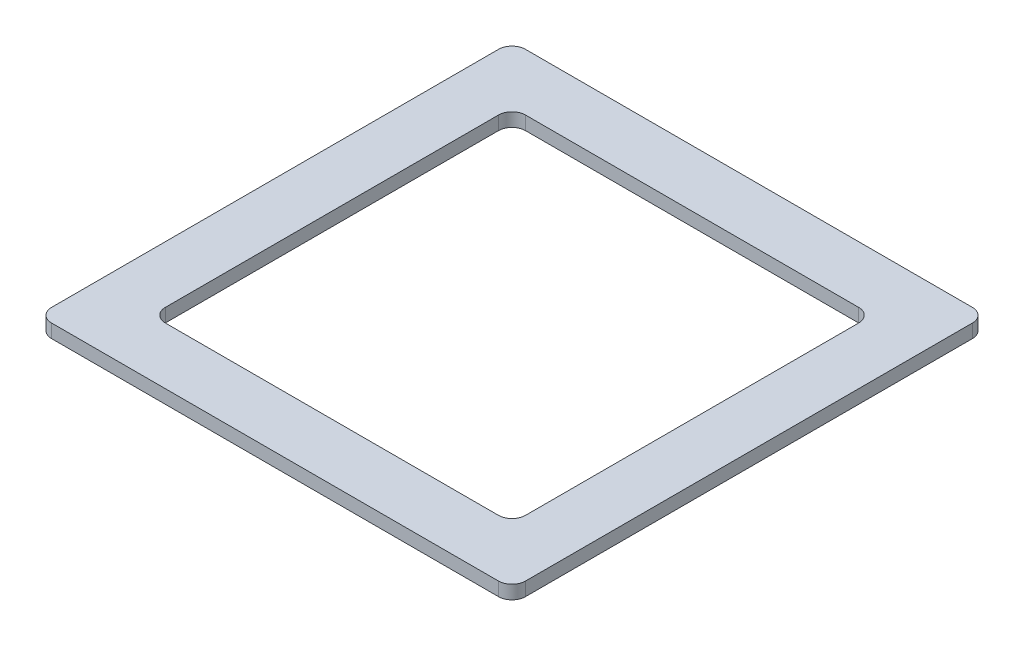
ISO-10303-21;
HEADER;
FILE_DESCRIPTION(('STEP AP214'),'2;1');
FILE_NAME('part.step','',(''),(''),'','','');
FILE_SCHEMA(('AUTOMOTIVE_DESIGN { 1 0 10303 214 1 1 1 1 }'));
ENDSEC;
DATA;
#1=APPLICATION_CONTEXT('core data for automotive mechanical design processes');
#2=APPLICATION_PROTOCOL_DEFINITION('international standard','automotive_design',2000,#1);
#3=PRODUCT_CONTEXT('',#1,'mechanical');
#4=PRODUCT('Part','Part','',(#3));
#5=PRODUCT_RELATED_PRODUCT_CATEGORY('part','',(#4));
#6=PRODUCT_DEFINITION_FORMATION('','',#4);
#7=PRODUCT_DEFINITION_CONTEXT('part definition',#1,'design');
#8=PRODUCT_DEFINITION('design','',#6,#7);
#9=PRODUCT_DEFINITION_SHAPE('','',#8);
#10=(LENGTH_UNIT() NAMED_UNIT(*) SI_UNIT(.MILLI.,.METRE.));
#11=(NAMED_UNIT(*) PLANE_ANGLE_UNIT() SI_UNIT($,.RADIAN.));
#12=(NAMED_UNIT(*) SI_UNIT($,.STERADIAN.) SOLID_ANGLE_UNIT());
#13=UNCERTAINTY_MEASURE_WITH_UNIT(LENGTH_MEASURE(1.E-05),#10,'distance_accuracy_value','');
#14=(GEOMETRIC_REPRESENTATION_CONTEXT(3) GLOBAL_UNCERTAINTY_ASSIGNED_CONTEXT((#13)) GLOBAL_UNIT_ASSIGNED_CONTEXT((#10,
#11,#12)) REPRESENTATION_CONTEXT('',''));
#15=CARTESIAN_POINT('',(0.,0.,0.));
#16=DIRECTION('',(0.,0.,1.));
#17=DIRECTION('',(1.,0.,0.));
#18=AXIS2_PLACEMENT_3D('',#15,#16,#17);
#19=CARTESIAN_POINT('',(175.,10.,175.));
#20=DIRECTION('',(-1.,0.,0.));
#21=DIRECTION('',(0.,0.,1.));
#22=AXIS2_PLACEMENT_3D('',#19,#20,#21);
#23=PLANE('',#22);
#24=DIRECTION('',(0.,0.,-1.));
#25=VECTOR('',#24,1.);
#26=CARTESIAN_POINT('',(175.,0.,175.));
#27=LINE('',#26,#25);
#28=CARTESIAN_POINT('',(175.,0.,165.));
#29=VERTEX_POINT('',#28);
#30=CARTESIAN_POINT('',(175.,0.,-165.));
#31=VERTEX_POINT('',#30);
#32=EDGE_CURVE('E195',#29,#31,#27,.T.);
#33=ORIENTED_EDGE('',*,*,#32,.T.);
#34=DIRECTION('',(0.,-1.,0.));
#35=VECTOR('',#34,1.);
#36=CARTESIAN_POINT('',(175.,10.,-165.));
#37=LINE('',#36,#35);
#38=CARTESIAN_POINT('',(175.,10.,-165.));
#39=VERTEX_POINT('',#38);
#40=EDGE_CURVE('E226',#31,#39,#37,.F.);
#41=ORIENTED_EDGE('',*,*,#40,.T.);
#42=DIRECTION('',(0.,0.,-1.));
#43=VECTOR('',#42,1.);
#44=CARTESIAN_POINT('',(175.,10.,175.));
#45=LINE('',#44,#43);
#46=CARTESIAN_POINT('',(175.,10.,165.));
#47=VERTEX_POINT('',#46);
#48=EDGE_CURVE('E184',#47,#39,#45,.T.);
#49=ORIENTED_EDGE('',*,*,#48,.F.);
#50=DIRECTION('',(0.,-1.,0.));
#51=VECTOR('',#50,1.);
#52=CARTESIAN_POINT('',(175.,10.,165.));
#53=LINE('',#52,#51);
#54=EDGE_CURVE('E223',#47,#29,#53,.T.);
#55=ORIENTED_EDGE('',*,*,#54,.T.);
#56=EDGE_LOOP('',(#33,#41,#49,#55));
#57=FACE_BOUND('',#56,.T.);
#58=ADVANCED_FACE('F33',(#57),#23,.F.);
#59=CARTESIAN_POINT('',(-175.,10.,-175.));
#60=DIRECTION('',(0.,0.,1.));
#61=DIRECTION('',(1.,0.,0.));
#62=AXIS2_PLACEMENT_3D('',#59,#60,#61);
#63=PLANE('',#62);
#64=DIRECTION('',(-1.,0.,0.));
#65=VECTOR('',#64,1.);
#66=CARTESIAN_POINT('',(-175.,10.,-175.));
#67=LINE('',#66,#65);
#68=CARTESIAN_POINT('',(165.,10.,-175.));
#69=VERTEX_POINT('',#68);
#70=CARTESIAN_POINT('',(-165.,10.,-175.));
#71=VERTEX_POINT('',#70);
#72=EDGE_CURVE('E187',#69,#71,#67,.T.);
#73=ORIENTED_EDGE('',*,*,#72,.F.);
#74=DIRECTION('',(0.,-1.,0.));
#75=VECTOR('',#74,1.);
#76=CARTESIAN_POINT('',(165.,10.,-175.));
#77=LINE('',#76,#75);
#78=CARTESIAN_POINT('',(165.,0.,-175.));
#79=VERTEX_POINT('',#78);
#80=EDGE_CURVE('E212',#69,#79,#77,.T.);
#81=ORIENTED_EDGE('',*,*,#80,.T.);
#82=DIRECTION('',(-1.,0.,0.));
#83=VECTOR('',#82,1.);
#84=CARTESIAN_POINT('',(-175.,0.,-175.));
#85=LINE('',#84,#83);
#86=CARTESIAN_POINT('',(-165.,0.,-175.));
#87=VERTEX_POINT('',#86);
#88=EDGE_CURVE('E198',#79,#87,#85,.T.);
#89=ORIENTED_EDGE('',*,*,#88,.T.);
#90=DIRECTION('',(0.,-1.,0.));
#91=VECTOR('',#90,1.);
#92=CARTESIAN_POINT('',(-165.,10.,-175.));
#93=LINE('',#92,#91);
#94=EDGE_CURVE('E210',#87,#71,#93,.F.);
#95=ORIENTED_EDGE('',*,*,#94,.T.);
#96=EDGE_LOOP('',(#73,#81,#89,#95));
#97=FACE_BOUND('',#96,.T.);
#98=ADVANCED_FACE('F308',(#97),#63,.F.);
#99=CARTESIAN_POINT('',(-175.,10.,175.));
#100=DIRECTION('',(1.,0.,0.));
#101=DIRECTION('',(0.,0.,-1.));
#102=AXIS2_PLACEMENT_3D('',#99,#100,#101);
#103=PLANE('',#102);
#104=DIRECTION('',(0.,0.,1.));
#105=VECTOR('',#104,1.);
#106=CARTESIAN_POINT('',(-175.,10.,175.));
#107=LINE('',#106,#105);
#108=CARTESIAN_POINT('',(-175.,10.,-165.));
#109=VERTEX_POINT('',#108);
#110=CARTESIAN_POINT('',(-175.,10.,165.));
#111=VERTEX_POINT('',#110);
#112=EDGE_CURVE('E191',#109,#111,#107,.T.);
#113=ORIENTED_EDGE('',*,*,#112,.F.);
#114=DIRECTION('',(0.,-1.,0.));
#115=VECTOR('',#114,1.);
#116=CARTESIAN_POINT('',(-175.,10.,-165.));
#117=LINE('',#116,#115);
#118=CARTESIAN_POINT('',(-175.,0.,-165.));
#119=VERTEX_POINT('',#118);
#120=EDGE_CURVE('E158',#109,#119,#117,.T.);
#121=ORIENTED_EDGE('',*,*,#120,.T.);
#122=DIRECTION('',(0.,0.,1.));
#123=VECTOR('',#122,1.);
#124=CARTESIAN_POINT('',(-175.,0.,175.));
#125=LINE('',#124,#123);
#126=CARTESIAN_POINT('',(-175.,0.,165.));
#127=VERTEX_POINT('',#126);
#128=EDGE_CURVE('E202',#119,#127,#125,.T.);
#129=ORIENTED_EDGE('',*,*,#128,.T.);
#130=DIRECTION('',(0.,-1.,0.));
#131=VECTOR('',#130,1.);
#132=CARTESIAN_POINT('',(-175.,10.,165.));
#133=LINE('',#132,#131);
#134=EDGE_CURVE('E249',#127,#111,#133,.F.);
#135=ORIENTED_EDGE('',*,*,#134,.T.);
#136=EDGE_LOOP('',(#113,#121,#129,#135));
#137=FACE_BOUND('',#136,.T.);
#138=ADVANCED_FACE('F314',(#137),#103,.F.);
#139=CARTESIAN_POINT('',(-175.,10.,175.));
#140=DIRECTION('',(0.,0.,-1.));
#141=DIRECTION('',(-1.,0.,0.));
#142=AXIS2_PLACEMENT_3D('',#139,#140,#141);
#143=PLANE('',#142);
#144=DIRECTION('',(1.,0.,0.));
#145=VECTOR('',#144,1.);
#146=CARTESIAN_POINT('',(-175.,0.,175.));
#147=LINE('',#146,#145);
#148=CARTESIAN_POINT('',(-165.,0.,175.));
#149=VERTEX_POINT('',#148);
#150=CARTESIAN_POINT('',(165.,0.,175.));
#151=VERTEX_POINT('',#150);
#152=EDGE_CURVE('E188',#149,#151,#147,.T.);
#153=ORIENTED_EDGE('',*,*,#152,.T.);
#154=DIRECTION('',(0.,-1.,0.));
#155=VECTOR('',#154,1.);
#156=CARTESIAN_POINT('',(165.,10.,175.));
#157=LINE('',#156,#155);
#158=CARTESIAN_POINT('',(165.,10.,175.));
#159=VERTEX_POINT('',#158);
#160=EDGE_CURVE('E48',#151,#159,#157,.F.);
#161=ORIENTED_EDGE('',*,*,#160,.T.);
#162=DIRECTION('',(1.,0.,0.));
#163=VECTOR('',#162,1.);
#164=CARTESIAN_POINT('',(-175.,10.,175.));
#165=LINE('',#164,#163);
#166=CARTESIAN_POINT('',(-165.,10.,175.));
#167=VERTEX_POINT('',#166);
#168=EDGE_CURVE('E193',#167,#159,#165,.T.);
#169=ORIENTED_EDGE('',*,*,#168,.F.);
#170=DIRECTION('',(0.,-1.,0.));
#171=VECTOR('',#170,1.);
#172=CARTESIAN_POINT('',(-165.,10.,175.));
#173=LINE('',#172,#171);
#174=EDGE_CURVE('E245',#167,#149,#173,.T.);
#175=ORIENTED_EDGE('',*,*,#174,.T.);
#176=EDGE_LOOP('',(#153,#161,#169,#175));
#177=FACE_BOUND('',#176,.T.);
#178=ADVANCED_FACE('F334',(#177),#143,.F.);
#179=CARTESIAN_POINT('',(0.,10.,0.));
#180=DIRECTION('',(0.,-1.,0.));
#181=DIRECTION('',(0.,0.,-1.));
#182=AXIS2_PLACEMENT_3D('',#179,#180,#181);
#183=PLANE('',#182);
#184=DIRECTION('',(-1.,0.,0.));
#185=VECTOR('',#184,1.);
#186=CARTESIAN_POINT('',(-133.,10.,-133.));
#187=LINE('',#186,#185);
#188=CARTESIAN_POINT('',(123.,10.,-133.));
#189=VERTEX_POINT('',#188);
#190=CARTESIAN_POINT('',(-123.,10.,-133.));
#191=VERTEX_POINT('',#190);
#192=EDGE_CURVE('E175',#189,#191,#187,.T.);
#193=ORIENTED_EDGE('',*,*,#192,.F.);
#194=CARTESIAN_POINT('',(123.,10.,-123.));
#195=DIRECTION('',(0.,-1.,0.));
#196=DIRECTION('',(0.,0.,-1.));
#197=AXIS2_PLACEMENT_3D('',#194,#195,#196);
#198=CIRCLE('',#197,10.);
#199=CARTESIAN_POINT('',(133.,10.,-123.));
#200=VERTEX_POINT('',#199);
#201=EDGE_CURVE('E41',#189,#200,#198,.T.);
#202=ORIENTED_EDGE('',*,*,#201,.T.);
#203=DIRECTION('',(0.,0.,-1.));
#204=VECTOR('',#203,1.);
#205=CARTESIAN_POINT('',(133.,10.,133.));
#206=LINE('',#205,#204);
#207=CARTESIAN_POINT('',(133.,10.,123.));
#208=VERTEX_POINT('',#207);
#209=EDGE_CURVE('E180',#208,#200,#206,.T.);
#210=ORIENTED_EDGE('',*,*,#209,.F.);
#211=CARTESIAN_POINT('',(123.,10.,123.));
#212=DIRECTION('',(0.,-1.,0.));
#213=DIRECTION('',(0.,0.,-1.));
#214=AXIS2_PLACEMENT_3D('',#211,#212,#213);
#215=CIRCLE('',#214,10.);
#216=CARTESIAN_POINT('',(123.,10.,133.));
#217=VERTEX_POINT('',#216);
#218=EDGE_CURVE('E257',#208,#217,#215,.T.);
#219=ORIENTED_EDGE('',*,*,#218,.T.);
#220=DIRECTION('',(1.,0.,0.));
#221=VECTOR('',#220,1.);
#222=CARTESIAN_POINT('',(-133.,10.,133.));
#223=LINE('',#222,#221);
#224=CARTESIAN_POINT('',(-123.,10.,133.));
#225=VERTEX_POINT('',#224);
#226=EDGE_CURVE('E174',#225,#217,#223,.T.);
#227=ORIENTED_EDGE('',*,*,#226,.F.);
#228=CARTESIAN_POINT('',(-123.,10.,123.));
#229=DIRECTION('',(0.,-1.,0.));
#230=DIRECTION('',(0.,0.,-1.));
#231=AXIS2_PLACEMENT_3D('',#228,#229,#230);
#232=CIRCLE('',#231,10.);
#233=CARTESIAN_POINT('',(-133.,10.,123.));
#234=VERTEX_POINT('',#233);
#235=EDGE_CURVE('E173',#225,#234,#232,.T.);
#236=ORIENTED_EDGE('',*,*,#235,.T.);
#237=DIRECTION('',(0.,0.,1.));
#238=VECTOR('',#237,1.);
#239=CARTESIAN_POINT('',(-133.,10.,133.));
#240=LINE('',#239,#238);
#241=CARTESIAN_POINT('',(-133.,10.,-123.));
#242=VERTEX_POINT('',#241);
#243=EDGE_CURVE('E164',#242,#234,#240,.T.);
#244=ORIENTED_EDGE('',*,*,#243,.F.);
#245=CARTESIAN_POINT('',(-123.,10.,-123.));
#246=DIRECTION('',(0.,-1.,0.));
#247=DIRECTION('',(0.,0.,-1.));
#248=AXIS2_PLACEMENT_3D('',#245,#246,#247);
#249=CIRCLE('',#248,10.);
#250=EDGE_CURVE('E147',#242,#191,#249,.T.);
#251=ORIENTED_EDGE('',*,*,#250,.T.);
#252=EDGE_LOOP('',(#193,#202,#210,#219,#227,#236,#244,#251));
#253=FACE_BOUND('',#252,.T.);
#254=ORIENTED_EDGE('',*,*,#48,.T.);
#255=CARTESIAN_POINT('',(165.,10.,-165.));
#256=DIRECTION('',(0.,-1.,0.));
#257=DIRECTION('',(0.,0.,-1.));
#258=AXIS2_PLACEMENT_3D('',#255,#256,#257);
#259=CIRCLE('',#258,10.);
#260=EDGE_CURVE('E233',#39,#69,#259,.F.);
#261=ORIENTED_EDGE('',*,*,#260,.T.);
#262=ORIENTED_EDGE('',*,*,#72,.T.);
#263=CARTESIAN_POINT('',(-165.,10.,-165.));
#264=DIRECTION('',(0.,-1.,0.));
#265=DIRECTION('',(0.,0.,-1.));
#266=AXIS2_PLACEMENT_3D('',#263,#264,#265);
#267=CIRCLE('',#266,10.);
#268=EDGE_CURVE('E229',#71,#109,#267,.F.);
#269=ORIENTED_EDGE('',*,*,#268,.T.);
#270=ORIENTED_EDGE('',*,*,#112,.T.);
#271=CARTESIAN_POINT('',(-165.,10.,165.));
#272=DIRECTION('',(0.,-1.,0.));
#273=DIRECTION('',(0.,0.,-1.));
#274=AXIS2_PLACEMENT_3D('',#271,#272,#273);
#275=CIRCLE('',#274,10.);
#276=EDGE_CURVE('E55',#111,#167,#275,.F.);
#277=ORIENTED_EDGE('',*,*,#276,.T.);
#278=ORIENTED_EDGE('',*,*,#168,.T.);
#279=CARTESIAN_POINT('',(165.,10.,165.));
#280=DIRECTION('',(0.,-1.,0.));
#281=DIRECTION('',(0.,0.,-1.));
#282=AXIS2_PLACEMENT_3D('',#279,#280,#281);
#283=CIRCLE('',#282,10.);
#284=EDGE_CURVE('E231',#159,#47,#283,.F.);
#285=ORIENTED_EDGE('',*,*,#284,.T.);
#286=EDGE_LOOP('',(#254,#261,#262,#269,#270,#277,#278,#285));
#287=FACE_BOUND('',#286,.T.);
#288=ADVANCED_FACE('F171',(#253,#287),#183,.F.);
#289=CARTESIAN_POINT('',(0.,0.,0.));
#290=DIRECTION('',(0.,-1.,0.));
#291=DIRECTION('',(0.,0.,-1.));
#292=AXIS2_PLACEMENT_3D('',#289,#290,#291);
#293=PLANE('',#292);
#294=DIRECTION('',(1.,0.,0.));
#295=VECTOR('',#294,1.);
#296=CARTESIAN_POINT('',(-133.,0.,133.));
#297=LINE('',#296,#295);
#298=CARTESIAN_POINT('',(-123.,0.,133.));
#299=VERTEX_POINT('',#298);
#300=CARTESIAN_POINT('',(123.,0.,133.));
#301=VERTEX_POINT('',#300);
#302=EDGE_CURVE('E199',#299,#301,#297,.T.);
#303=ORIENTED_EDGE('',*,*,#302,.T.);
#304=CARTESIAN_POINT('',(123.,0.,123.));
#305=DIRECTION('',(0.,-1.,0.));
#306=DIRECTION('',(0.,0.,-1.));
#307=AXIS2_PLACEMENT_3D('',#304,#305,#306);
#308=CIRCLE('',#307,10.);
#309=CARTESIAN_POINT('',(133.,0.,123.));
#310=VERTEX_POINT('',#309);
#311=EDGE_CURVE('E259',#301,#310,#308,.F.);
#312=ORIENTED_EDGE('',*,*,#311,.T.);
#313=DIRECTION('',(0.,0.,-1.));
#314=VECTOR('',#313,1.);
#315=CARTESIAN_POINT('',(133.,0.,133.));
#316=LINE('',#315,#314);
#317=CARTESIAN_POINT('',(133.,0.,-123.));
#318=VERTEX_POINT('',#317);
#319=EDGE_CURVE('E178',#310,#318,#316,.T.);
#320=ORIENTED_EDGE('',*,*,#319,.T.);
#321=CARTESIAN_POINT('',(123.,0.,-123.));
#322=DIRECTION('',(0.,-1.,0.));
#323=DIRECTION('',(0.,0.,-1.));
#324=AXIS2_PLACEMENT_3D('',#321,#322,#323);
#325=CIRCLE('',#324,10.);
#326=CARTESIAN_POINT('',(123.,0.,-133.));
#327=VERTEX_POINT('',#326);
#328=EDGE_CURVE('E11',#318,#327,#325,.F.);
#329=ORIENTED_EDGE('',*,*,#328,.T.);
#330=DIRECTION('',(-1.,0.,0.));
#331=VECTOR('',#330,1.);
#332=CARTESIAN_POINT('',(-133.,0.,-133.));
#333=LINE('',#332,#331);
#334=CARTESIAN_POINT('',(-123.,0.,-133.));
#335=VERTEX_POINT('',#334);
#336=EDGE_CURVE('E278',#327,#335,#333,.T.);
#337=ORIENTED_EDGE('',*,*,#336,.T.);
#338=CARTESIAN_POINT('',(-123.,0.,-123.));
#339=DIRECTION('',(0.,-1.,0.));
#340=DIRECTION('',(0.,0.,-1.));
#341=AXIS2_PLACEMENT_3D('',#338,#339,#340);
#342=CIRCLE('',#341,10.);
#343=CARTESIAN_POINT('',(-133.,0.,-123.));
#344=VERTEX_POINT('',#343);
#345=EDGE_CURVE('E157',#335,#344,#342,.F.);
#346=ORIENTED_EDGE('',*,*,#345,.T.);
#347=DIRECTION('',(0.,0.,1.));
#348=VECTOR('',#347,1.);
#349=CARTESIAN_POINT('',(-133.,0.,133.));
#350=LINE('',#349,#348);
#351=CARTESIAN_POINT('',(-133.,0.,123.));
#352=VERTEX_POINT('',#351);
#353=EDGE_CURVE('E167',#344,#352,#350,.T.);
#354=ORIENTED_EDGE('',*,*,#353,.T.);
#355=CARTESIAN_POINT('',(-123.,0.,123.));
#356=DIRECTION('',(0.,-1.,0.));
#357=DIRECTION('',(0.,0.,-1.));
#358=AXIS2_PLACEMENT_3D('',#355,#356,#357);
#359=CIRCLE('',#358,10.);
#360=EDGE_CURVE('E255',#352,#299,#359,.F.);
#361=ORIENTED_EDGE('',*,*,#360,.T.);
#362=EDGE_LOOP('',(#303,#312,#320,#329,#337,#346,#354,#361));
#363=FACE_BOUND('',#362,.T.);
#364=ORIENTED_EDGE('',*,*,#88,.F.);
#365=CARTESIAN_POINT('',(165.,0.,-165.));
#366=DIRECTION('',(0.,-1.,0.));
#367=DIRECTION('',(0.,0.,-1.));
#368=AXIS2_PLACEMENT_3D('',#365,#366,#367);
#369=CIRCLE('',#368,10.);
#370=EDGE_CURVE('E221',#79,#31,#369,.T.);
#371=ORIENTED_EDGE('',*,*,#370,.T.);
#372=ORIENTED_EDGE('',*,*,#32,.F.);
#373=CARTESIAN_POINT('',(165.,0.,165.));
#374=DIRECTION('',(0.,-1.,0.));
#375=DIRECTION('',(0.,0.,-1.));
#376=AXIS2_PLACEMENT_3D('',#373,#374,#375);
#377=CIRCLE('',#376,10.);
#378=EDGE_CURVE('E219',#29,#151,#377,.T.);
#379=ORIENTED_EDGE('',*,*,#378,.T.);
#380=ORIENTED_EDGE('',*,*,#152,.F.);
#381=CARTESIAN_POINT('',(-165.,0.,165.));
#382=DIRECTION('',(0.,-1.,0.));
#383=DIRECTION('',(0.,0.,-1.));
#384=AXIS2_PLACEMENT_3D('',#381,#382,#383);
#385=CIRCLE('',#384,10.);
#386=EDGE_CURVE('E215',#149,#127,#385,.T.);
#387=ORIENTED_EDGE('',*,*,#386,.T.);
#388=ORIENTED_EDGE('',*,*,#128,.F.);
#389=CARTESIAN_POINT('',(-165.,0.,-165.));
#390=DIRECTION('',(0.,-1.,0.));
#391=DIRECTION('',(0.,0.,-1.));
#392=AXIS2_PLACEMENT_3D('',#389,#390,#391);
#393=CIRCLE('',#392,10.);
#394=EDGE_CURVE('E217',#119,#87,#393,.T.);
#395=ORIENTED_EDGE('',*,*,#394,.T.);
#396=EDGE_LOOP('',(#364,#371,#372,#379,#380,#387,#388,#395));
#397=FACE_BOUND('',#396,.T.);
#398=ADVANCED_FACE('F276',(#363,#397),#293,.T.);
#399=CARTESIAN_POINT('',(133.,0.,133.));
#400=DIRECTION('',(1.,0.,0.));
#401=DIRECTION('',(0.,0.,-1.));
#402=AXIS2_PLACEMENT_3D('',#399,#400,#401);
#403=PLANE('',#402);
#404=ORIENTED_EDGE('',*,*,#319,.F.);
#405=DIRECTION('',(0.,1.,0.));
#406=VECTOR('',#405,1.);
#407=CARTESIAN_POINT('',(133.,10.,123.));
#408=LINE('',#407,#406);
#409=EDGE_CURVE('E242',#310,#208,#408,.T.);
#410=ORIENTED_EDGE('',*,*,#409,.T.);
#411=ORIENTED_EDGE('',*,*,#209,.T.);
#412=DIRECTION('',(0.,1.,0.));
#413=VECTOR('',#412,1.);
#414=CARTESIAN_POINT('',(133.,0.,-123.));
#415=LINE('',#414,#413);
#416=EDGE_CURVE('E240',#200,#318,#415,.F.);
#417=ORIENTED_EDGE('',*,*,#416,.T.);
#418=EDGE_LOOP('',(#404,#410,#411,#417));
#419=FACE_BOUND('',#418,.T.);
#420=ADVANCED_FACE('F267',(#419),#403,.F.);
#421=CARTESIAN_POINT('',(-133.,0.,133.));
#422=DIRECTION('',(0.,0.,1.));
#423=DIRECTION('',(1.,0.,0.));
#424=AXIS2_PLACEMENT_3D('',#421,#422,#423);
#425=PLANE('',#424);
#426=ORIENTED_EDGE('',*,*,#302,.F.);
#427=DIRECTION('',(0.,1.,0.));
#428=VECTOR('',#427,1.);
#429=CARTESIAN_POINT('',(-123.,10.,133.));
#430=LINE('',#429,#428);
#431=EDGE_CURVE('E237',#299,#225,#430,.T.);
#432=ORIENTED_EDGE('',*,*,#431,.T.);
#433=ORIENTED_EDGE('',*,*,#226,.T.);
#434=DIRECTION('',(0.,1.,0.));
#435=VECTOR('',#434,1.);
#436=CARTESIAN_POINT('',(123.,0.,133.));
#437=LINE('',#436,#435);
#438=EDGE_CURVE('E235',#217,#301,#437,.F.);
#439=ORIENTED_EDGE('',*,*,#438,.T.);
#440=EDGE_LOOP('',(#426,#432,#433,#439));
#441=FACE_BOUND('',#440,.T.);
#442=ADVANCED_FACE('F293',(#441),#425,.F.);
#443=CARTESIAN_POINT('',(-133.,0.,133.));
#444=DIRECTION('',(-1.,0.,0.));
#445=DIRECTION('',(0.,0.,1.));
#446=AXIS2_PLACEMENT_3D('',#443,#444,#445);
#447=PLANE('',#446);
#448=ORIENTED_EDGE('',*,*,#353,.F.);
#449=DIRECTION('',(0.,1.,0.));
#450=VECTOR('',#449,1.);
#451=CARTESIAN_POINT('',(-133.,10.,-123.));
#452=LINE('',#451,#450);
#453=EDGE_CURVE('E151',#344,#242,#452,.T.);
#454=ORIENTED_EDGE('',*,*,#453,.T.);
#455=ORIENTED_EDGE('',*,*,#243,.T.);
#456=DIRECTION('',(0.,1.,0.));
#457=VECTOR('',#456,1.);
#458=CARTESIAN_POINT('',(-133.,0.,123.));
#459=LINE('',#458,#457);
#460=EDGE_CURVE('E169',#234,#352,#459,.F.);
#461=ORIENTED_EDGE('',*,*,#460,.T.);
#462=EDGE_LOOP('',(#448,#454,#455,#461));
#463=FACE_BOUND('',#462,.T.);
#464=ADVANCED_FACE('F163',(#463),#447,.F.);
#465=CARTESIAN_POINT('',(-133.,0.,-133.));
#466=DIRECTION('',(0.,0.,-1.));
#467=DIRECTION('',(-1.,0.,0.));
#468=AXIS2_PLACEMENT_3D('',#465,#466,#467);
#469=PLANE('',#468);
#470=ORIENTED_EDGE('',*,*,#192,.T.);
#471=DIRECTION('',(0.,1.,0.));
#472=VECTOR('',#471,1.);
#473=CARTESIAN_POINT('',(-123.,0.,-133.));
#474=LINE('',#473,#472);
#475=EDGE_CURVE('E152',#191,#335,#474,.F.);
#476=ORIENTED_EDGE('',*,*,#475,.T.);
#477=ORIENTED_EDGE('',*,*,#336,.F.);
#478=DIRECTION('',(0.,1.,0.));
#479=VECTOR('',#478,1.);
#480=CARTESIAN_POINT('',(123.,10.,-133.));
#481=LINE('',#480,#479);
#482=EDGE_CURVE('E168',#327,#189,#481,.T.);
#483=ORIENTED_EDGE('',*,*,#482,.T.);
#484=EDGE_LOOP('',(#470,#476,#477,#483));
#485=FACE_BOUND('',#484,.T.);
#486=ADVANCED_FACE('F280',(#485),#469,.F.);
#487=CARTESIAN_POINT('',(-123.,0.,-123.));
#488=DIRECTION('',(0.,-1.,0.));
#489=DIRECTION('',(0.,0.,-1.));
#490=AXIS2_PLACEMENT_3D('',#487,#488,#489);
#491=CYLINDRICAL_SURFACE('',#490,10.);
#492=ORIENTED_EDGE('',*,*,#345,.F.);
#493=ORIENTED_EDGE('',*,*,#475,.F.);
#494=ORIENTED_EDGE('',*,*,#250,.F.);
#495=ORIENTED_EDGE('',*,*,#453,.F.);
#496=EDGE_LOOP('',(#492,#493,#494,#495));
#497=FACE_BOUND('',#496,.T.);
#498=ADVANCED_FACE('F150',(#497),#491,.F.);
#499=CARTESIAN_POINT('',(165.,10.,-165.));
#500=DIRECTION('',(0.,-1.,0.));
#501=DIRECTION('',(0.,0.,-1.));
#502=AXIS2_PLACEMENT_3D('',#499,#500,#501);
#503=CYLINDRICAL_SURFACE('',#502,10.);
#504=ORIENTED_EDGE('',*,*,#260,.F.);
#505=ORIENTED_EDGE('',*,*,#40,.F.);
#506=ORIENTED_EDGE('',*,*,#370,.F.);
#507=ORIENTED_EDGE('',*,*,#80,.F.);
#508=EDGE_LOOP('',(#504,#505,#506,#507));
#509=FACE_BOUND('',#508,.T.);
#510=ADVANCED_FACE('F297',(#509),#503,.T.);
#511=CARTESIAN_POINT('',(-123.,0.,123.));
#512=DIRECTION('',(0.,-1.,0.));
#513=DIRECTION('',(0.,0.,-1.));
#514=AXIS2_PLACEMENT_3D('',#511,#512,#513);
#515=CYLINDRICAL_SURFACE('',#514,10.);
#516=ORIENTED_EDGE('',*,*,#360,.F.);
#517=ORIENTED_EDGE('',*,*,#460,.F.);
#518=ORIENTED_EDGE('',*,*,#235,.F.);
#519=ORIENTED_EDGE('',*,*,#431,.F.);
#520=EDGE_LOOP('',(#516,#517,#518,#519));
#521=FACE_BOUND('',#520,.T.);
#522=ADVANCED_FACE('F295',(#521),#515,.F.);
#523=CARTESIAN_POINT('',(123.,0.,123.));
#524=DIRECTION('',(0.,-1.,0.));
#525=DIRECTION('',(0.,0.,-1.));
#526=AXIS2_PLACEMENT_3D('',#523,#524,#525);
#527=CYLINDRICAL_SURFACE('',#526,10.);
#528=ORIENTED_EDGE('',*,*,#311,.F.);
#529=ORIENTED_EDGE('',*,*,#438,.F.);
#530=ORIENTED_EDGE('',*,*,#218,.F.);
#531=ORIENTED_EDGE('',*,*,#409,.F.);
#532=EDGE_LOOP('',(#528,#529,#530,#531));
#533=FACE_BOUND('',#532,.T.);
#534=ADVANCED_FACE('F292',(#533),#527,.F.);
#535=CARTESIAN_POINT('',(165.,10.,165.));
#536=DIRECTION('',(0.,-1.,0.));
#537=DIRECTION('',(0.,0.,-1.));
#538=AXIS2_PLACEMENT_3D('',#535,#536,#537);
#539=CYLINDRICAL_SURFACE('',#538,10.);
#540=ORIENTED_EDGE('',*,*,#284,.F.);
#541=ORIENTED_EDGE('',*,*,#160,.F.);
#542=ORIENTED_EDGE('',*,*,#378,.F.);
#543=ORIENTED_EDGE('',*,*,#54,.F.);
#544=EDGE_LOOP('',(#540,#541,#542,#543));
#545=FACE_BOUND('',#544,.T.);
#546=ADVANCED_FACE('F303',(#545),#539,.T.);
#547=CARTESIAN_POINT('',(123.,0.,-123.));
#548=DIRECTION('',(0.,-1.,0.));
#549=DIRECTION('',(0.,0.,-1.));
#550=AXIS2_PLACEMENT_3D('',#547,#548,#549);
#551=CYLINDRICAL_SURFACE('',#550,10.);
#552=ORIENTED_EDGE('',*,*,#328,.F.);
#553=ORIENTED_EDGE('',*,*,#416,.F.);
#554=ORIENTED_EDGE('',*,*,#201,.F.);
#555=ORIENTED_EDGE('',*,*,#482,.F.);
#556=EDGE_LOOP('',(#552,#553,#554,#555));
#557=FACE_BOUND('',#556,.T.);
#558=ADVANCED_FACE('F271',(#557),#551,.F.);
#559=CARTESIAN_POINT('',(-165.,10.,-165.));
#560=DIRECTION('',(0.,-1.,0.));
#561=DIRECTION('',(0.,0.,-1.));
#562=AXIS2_PLACEMENT_3D('',#559,#560,#561);
#563=CYLINDRICAL_SURFACE('',#562,10.);
#564=ORIENTED_EDGE('',*,*,#268,.F.);
#565=ORIENTED_EDGE('',*,*,#94,.F.);
#566=ORIENTED_EDGE('',*,*,#394,.F.);
#567=ORIENTED_EDGE('',*,*,#120,.F.);
#568=EDGE_LOOP('',(#564,#565,#566,#567));
#569=FACE_BOUND('',#568,.T.);
#570=ADVANCED_FACE('F348',(#569),#563,.T.);
#571=CARTESIAN_POINT('',(-165.,10.,165.));
#572=DIRECTION('',(0.,-1.,0.));
#573=DIRECTION('',(0.,0.,-1.));
#574=AXIS2_PLACEMENT_3D('',#571,#572,#573);
#575=CYLINDRICAL_SURFACE('',#574,10.);
#576=ORIENTED_EDGE('',*,*,#276,.F.);
#577=ORIENTED_EDGE('',*,*,#134,.F.);
#578=ORIENTED_EDGE('',*,*,#386,.F.);
#579=ORIENTED_EDGE('',*,*,#174,.F.);
#580=EDGE_LOOP('',(#576,#577,#578,#579));
#581=FACE_BOUND('',#580,.T.);
#582=ADVANCED_FACE('F35',(#581),#575,.T.);
#583=CLOSED_SHELL('',(#58,#98,#138,#178,#288,#398,#420,#442,#464,#486,#498,#510,#522,#534,#546,
#558,#570,#582));
#584=MANIFOLD_SOLID_BREP('B2',#583);
#585=ADVANCED_BREP_SHAPE_REPRESENTATION('',(#18,#584),#14);
#586=SHAPE_DEFINITION_REPRESENTATION(#9,#585);
ENDSEC;
END-ISO-10303-21;
